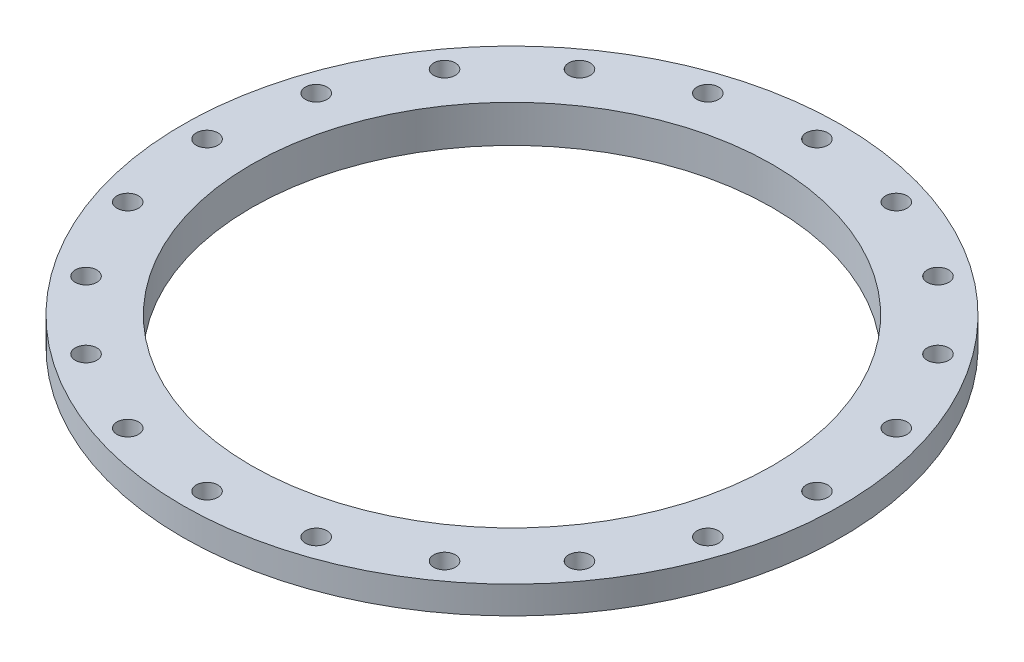
ISO-10303-21;
HEADER;
FILE_DESCRIPTION(('STEP AP214'),'2;1');
FILE_NAME('part.step','',(''),(''),'','','');
FILE_SCHEMA(('AUTOMOTIVE_DESIGN { 1 0 10303 214 1 1 1 1 }'));
ENDSEC;
DATA;
#1=APPLICATION_CONTEXT('core data for automotive mechanical design processes');
#2=APPLICATION_PROTOCOL_DEFINITION('international standard','automotive_design',2000,#1);
#3=PRODUCT_CONTEXT('',#1,'mechanical');
#4=PRODUCT('Part','Part','',(#3));
#5=PRODUCT_RELATED_PRODUCT_CATEGORY('part','',(#4));
#6=PRODUCT_DEFINITION_FORMATION('','',#4);
#7=PRODUCT_DEFINITION_CONTEXT('part definition',#1,'design');
#8=PRODUCT_DEFINITION('design','',#6,#7);
#9=PRODUCT_DEFINITION_SHAPE('','',#8);
#10=(LENGTH_UNIT() NAMED_UNIT(*) SI_UNIT(.MILLI.,.METRE.));
#11=(NAMED_UNIT(*) PLANE_ANGLE_UNIT() SI_UNIT($,.RADIAN.));
#12=(NAMED_UNIT(*) SI_UNIT($,.STERADIAN.) SOLID_ANGLE_UNIT());
#13=UNCERTAINTY_MEASURE_WITH_UNIT(LENGTH_MEASURE(1.E-05),#10,'distance_accuracy_value','');
#14=(GEOMETRIC_REPRESENTATION_CONTEXT(3) GLOBAL_UNCERTAINTY_ASSIGNED_CONTEXT((#13)) GLOBAL_UNIT_ASSIGNED_CONTEXT((#10,
#11,#12)) REPRESENTATION_CONTEXT('',''));
#15=CARTESIAN_POINT('',(0.,0.,0.));
#16=DIRECTION('',(0.,0.,1.));
#17=DIRECTION('',(1.,0.,0.));
#18=AXIS2_PLACEMENT_3D('',#15,#16,#17);
#19=CARTESIAN_POINT('',(0.,19.,265.));
#20=DIRECTION('',(0.,1.,0.));
#21=DIRECTION('',(0.,0.,1.));
#22=AXIS2_PLACEMENT_3D('',#19,#20,#21);
#23=PLANE('',#22);
#24=CARTESIAN_POINT('',(-294.827520051493,18.9999999999999,95.7952682562064));
#25=DIRECTION('',(0.,-1.,0.));
#26=DIRECTION('',(0.,0.,-1.));
#27=AXIS2_PLACEMENT_3D('',#24,#25,#26);
#28=CIRCLE('',#27,11.);
#29=CARTESIAN_POINT('',(-294.827520051493,18.9999999999999,84.7952682562064));
#30=VERTEX_POINT('',#29);
#31=EDGE_CURVE('E151',#30,#30,#28,.T.);
#32=ORIENTED_EDGE('',*,*,#31,.T.);
#33=EDGE_LOOP('',(#32));
#34=FACE_BOUND('',#33,.T.);
#35=CARTESIAN_POINT('',(-309.99999999999,18.9999999999999,-3.16175115773912E-11));
#36=DIRECTION('',(0.,-1.,0.));
#37=DIRECTION('',(0.,0.,-1.));
#38=AXIS2_PLACEMENT_3D('',#35,#36,#37);
#39=CIRCLE('',#38,11.);
#40=CARTESIAN_POINT('',(-309.99999999999,18.9999999999999,-11.0000000000317));
#41=VERTEX_POINT('',#40);
#42=EDGE_CURVE('E155',#41,#41,#39,.T.);
#43=ORIENTED_EDGE('',*,*,#42,.T.);
#44=EDGE_LOOP('',(#43));
#45=FACE_BOUND('',#44,.T.);
#46=CARTESIAN_POINT('',(-294.82752005148,18.9999999999999,-95.7952682562676));
#47=DIRECTION('',(0.,-1.,0.));
#48=DIRECTION('',(0.,0.,-1.));
#49=AXIS2_PLACEMENT_3D('',#46,#47,#48);
#50=CIRCLE('',#49,11.);
#51=CARTESIAN_POINT('',(-294.82752005148,18.9999999999999,-106.795268256268));
#52=VERTEX_POINT('',#51);
#53=EDGE_CURVE('E159',#52,#52,#50,.T.);
#54=ORIENTED_EDGE('',*,*,#53,.T.);
#55=EDGE_LOOP('',(#54));
#56=FACE_BOUND('',#55,.T.);
#57=CARTESIAN_POINT('',(-250.795268256209,18.9999999999999,-182.213428210701));
#58=DIRECTION('',(0.,-1.,0.));
#59=DIRECTION('',(0.,0.,-1.));
#60=AXIS2_PLACEMENT_3D('',#57,#58,#59);
#61=CIRCLE('',#60,11.);
#62=CARTESIAN_POINT('',(-250.795268256209,18.9999999999999,-193.213428210701));
#63=VERTEX_POINT('',#62);
#64=EDGE_CURVE('E163',#63,#63,#61,.T.);
#65=ORIENTED_EDGE('',*,*,#64,.T.);
#66=EDGE_LOOP('',(#65));
#67=FACE_BOUND('',#66,.T.);
#68=CARTESIAN_POINT('',(-182.213428210635,18.9999999999999,-250.795268256265));
#69=DIRECTION('',(0.,-1.,0.));
#70=DIRECTION('',(0.,0.,-1.));
#71=AXIS2_PLACEMENT_3D('',#68,#69,#70);
#72=CIRCLE('',#71,11.);
#73=CARTESIAN_POINT('',(-182.213428210635,18.9999999999999,-261.795268256265));
#74=VERTEX_POINT('',#73);
#75=EDGE_CURVE('E167',#74,#74,#72,.T.);
#76=ORIENTED_EDGE('',*,*,#75,.T.);
#77=EDGE_LOOP('',(#76));
#78=FACE_BOUND('',#77,.T.);
#79=CARTESIAN_POINT('',(-95.7952682561963,18.9999999999999,-294.827520051525));
#80=DIRECTION('',(0.,-1.,0.));
#81=DIRECTION('',(0.,0.,-1.));
#82=AXIS2_PLACEMENT_3D('',#79,#80,#81);
#83=CIRCLE('',#82,11.);
#84=CARTESIAN_POINT('',(-95.7952682561963,18.9999999999999,-305.827520051525));
#85=VERTEX_POINT('',#84);
#86=EDGE_CURVE('E171',#85,#85,#83,.T.);
#87=ORIENTED_EDGE('',*,*,#86,.T.);
#88=EDGE_LOOP('',(#87));
#89=FACE_BOUND('',#88,.T.);
#90=CARTESIAN_POINT('',(4.17618170672537E-11,18.9999999999999,-310.000000000021));
#91=DIRECTION('',(0.,-1.,0.));
#92=DIRECTION('',(0.,0.,-1.));
#93=AXIS2_PLACEMENT_3D('',#90,#91,#92);
#94=CIRCLE('',#93,11.);
#95=CARTESIAN_POINT('',(4.17618170672537E-11,18.9999999999999,-321.000000000021));
#96=VERTEX_POINT('',#95);
#97=EDGE_CURVE('E175',#96,#96,#94,.T.);
#98=ORIENTED_EDGE('',*,*,#97,.T.);
#99=EDGE_LOOP('',(#98));
#100=FACE_BOUND('',#99,.T.);
#101=CARTESIAN_POINT('',(95.7952682562777,18.9999999999999,-294.827520051512));
#102=DIRECTION('',(0.,-1.,0.));
#103=DIRECTION('',(0.,0.,-1.));
#104=AXIS2_PLACEMENT_3D('',#101,#102,#103);
#105=CIRCLE('',#104,11.);
#106=CARTESIAN_POINT('',(95.7952682562777,18.9999999999999,-305.827520051512));
#107=VERTEX_POINT('',#106);
#108=EDGE_CURVE('E179',#107,#107,#105,.T.);
#109=ORIENTED_EDGE('',*,*,#108,.T.);
#110=EDGE_LOOP('',(#109));
#111=FACE_BOUND('',#110,.T.);
#112=CARTESIAN_POINT('',(182.213428210711,18.9999999999999,-250.795268256241));
#113=DIRECTION('',(0.,-1.,0.));
#114=DIRECTION('',(0.,0.,-1.));
#115=AXIS2_PLACEMENT_3D('',#112,#113,#114);
#116=CIRCLE('',#115,11.);
#117=CARTESIAN_POINT('',(182.213428210711,18.9999999999999,-261.795268256241));
#118=VERTEX_POINT('',#117);
#119=EDGE_CURVE('E183',#118,#118,#116,.T.);
#120=ORIENTED_EDGE('',*,*,#119,.T.);
#121=EDGE_LOOP('',(#120));
#122=FACE_BOUND('',#121,.T.);
#123=CARTESIAN_POINT('',(250.795268256276,18.9999999999999,-182.213428210667));
#124=DIRECTION('',(0.,-1.,0.));
#125=DIRECTION('',(0.,0.,-1.));
#126=AXIS2_PLACEMENT_3D('',#123,#124,#125);
#127=CIRCLE('',#126,11.);
#128=CARTESIAN_POINT('',(250.795268256276,18.9999999999999,-193.213428210667));
#129=VERTEX_POINT('',#128);
#130=EDGE_CURVE('E187',#129,#129,#127,.T.);
#131=ORIENTED_EDGE('',*,*,#130,.T.);
#132=EDGE_LOOP('',(#131));
#133=FACE_BOUND('',#132,.T.);
#134=CARTESIAN_POINT('',(294.827520051535,18.9999999999999,-95.7952682562279));
#135=DIRECTION('',(0.,-1.,0.));
#136=DIRECTION('',(0.,0.,-1.));
#137=AXIS2_PLACEMENT_3D('',#134,#135,#136);
#138=CIRCLE('',#137,11.);
#139=CARTESIAN_POINT('',(294.827520051535,18.9999999999999,-106.795268256228));
#140=VERTEX_POINT('',#139);
#141=EDGE_CURVE('E191',#140,#140,#138,.T.);
#142=ORIENTED_EDGE('',*,*,#141,.T.);
#143=EDGE_LOOP('',(#142));
#144=FACE_BOUND('',#143,.T.);
#145=CARTESIAN_POINT('',(310.000000000032,18.9999999999999,1.01740318252108E-11));
#146=DIRECTION('',(0.,-1.,0.));
#147=DIRECTION('',(0.,0.,-1.));
#148=AXIS2_PLACEMENT_3D('',#145,#146,#147);
#149=CIRCLE('',#148,11.);
#150=CARTESIAN_POINT('',(310.000000000032,18.9999999999999,-10.9999999999899));
#151=VERTEX_POINT('',#150);
#152=EDGE_CURVE('E195',#151,#151,#149,.T.);
#153=ORIENTED_EDGE('',*,*,#152,.T.);
#154=EDGE_LOOP('',(#153));
#155=FACE_BOUND('',#154,.T.);
#156=CARTESIAN_POINT('',(294.827520051522,18.9999999999999,95.7952682562462));
#157=DIRECTION('',(0.,-1.,0.));
#158=DIRECTION('',(0.,0.,-1.));
#159=AXIS2_PLACEMENT_3D('',#156,#157,#158);
#160=CIRCLE('',#159,11.);
#161=CARTESIAN_POINT('',(294.827520051522,18.9999999999999,84.7952682562461));
#162=VERTEX_POINT('',#161);
#163=EDGE_CURVE('E199',#162,#162,#160,.T.);
#164=ORIENTED_EDGE('',*,*,#163,.T.);
#165=EDGE_LOOP('',(#164));
#166=FACE_BOUND('',#165,.T.);
#167=CARTESIAN_POINT('',(250.795268256251,18.9999999999999,182.213428210679));
#168=DIRECTION('',(0.,-1.,0.));
#169=DIRECTION('',(0.,0.,-1.));
#170=AXIS2_PLACEMENT_3D('',#167,#168,#169);
#171=CIRCLE('',#170,11.);
#172=CARTESIAN_POINT('',(250.795268256251,18.9999999999999,171.213428210679));
#173=VERTEX_POINT('',#172);
#174=EDGE_CURVE('E203',#173,#173,#171,.T.);
#175=ORIENTED_EDGE('',*,*,#174,.T.);
#176=EDGE_LOOP('',(#175));
#177=FACE_BOUND('',#176,.T.);
#178=CARTESIAN_POINT('',(182.213428210677,18.9999999999999,250.795268256244));
#179=DIRECTION('',(0.,-1.,0.));
#180=DIRECTION('',(0.,0.,-1.));
#181=AXIS2_PLACEMENT_3D('',#178,#179,#180);
#182=CIRCLE('',#181,11.);
#183=CARTESIAN_POINT('',(182.213428210677,18.9999999999999,239.795268256244));
#184=VERTEX_POINT('',#183);
#185=EDGE_CURVE('E207',#184,#184,#182,.T.);
#186=ORIENTED_EDGE('',*,*,#185,.T.);
#187=EDGE_LOOP('',(#186));
#188=FACE_BOUND('',#187,.T.);
#189=CARTESIAN_POINT('',(95.795268256234,18.9999999999999,294.827520051498));
#190=DIRECTION('',(0.,-1.,0.));
#191=DIRECTION('',(0.,0.,-1.));
#192=AXIS2_PLACEMENT_3D('',#189,#190,#191);
#193=CIRCLE('',#192,11.);
#194=CARTESIAN_POINT('',(95.795268256234,18.9999999999999,283.827520051498));
#195=VERTEX_POINT('',#194);
#196=EDGE_CURVE('E211',#195,#195,#193,.T.);
#197=ORIENTED_EDGE('',*,*,#196,.T.);
#198=EDGE_LOOP('',(#197));
#199=FACE_BOUND('',#198,.T.);
#200=CARTESIAN_POINT('',(-250.795268256234,18.9999999999999,182.213428210645));
#201=DIRECTION('',(0.,-1.,0.));
#202=DIRECTION('',(0.,0.,-1.));
#203=AXIS2_PLACEMENT_3D('',#200,#201,#202);
#204=CIRCLE('',#203,11.);
#205=CARTESIAN_POINT('',(-250.795268256234,18.9999999999999,171.213428210645));
#206=VERTEX_POINT('',#205);
#207=EDGE_CURVE('E215',#206,#206,#204,.T.);
#208=ORIENTED_EDGE('',*,*,#207,.T.);
#209=EDGE_LOOP('',(#208));
#210=FACE_BOUND('',#209,.T.);
#211=CARTESIAN_POINT('',(-182.213428210669,18.9999999999999,250.795268256219));
#212=DIRECTION('',(0.,-1.,0.));
#213=DIRECTION('',(0.,0.,-1.));
#214=AXIS2_PLACEMENT_3D('',#211,#212,#213);
#215=CIRCLE('',#214,11.);
#216=CARTESIAN_POINT('',(-182.213428210669,18.9999999999999,239.795268256219));
#217=VERTEX_POINT('',#216);
#218=EDGE_CURVE('E219',#217,#217,#215,.T.);
#219=ORIENTED_EDGE('',*,*,#218,.T.);
#220=EDGE_LOOP('',(#219));
#221=FACE_BOUND('',#220,.T.);
#222=CARTESIAN_POINT('',(-95.795268256236,18.9999999999999,294.827520051491));
#223=DIRECTION('',(0.,-1.,0.));
#224=DIRECTION('',(0.,0.,-1.));
#225=AXIS2_PLACEMENT_3D('',#222,#223,#224);
#226=CIRCLE('',#225,11.);
#227=CARTESIAN_POINT('',(-95.795268256236,18.9999999999999,283.827520051491));
#228=VERTEX_POINT('',#227);
#229=EDGE_CURVE('E223',#228,#228,#226,.T.);
#230=ORIENTED_EDGE('',*,*,#229,.T.);
#231=EDGE_LOOP('',(#230));
#232=FACE_BOUND('',#231,.T.);
#233=CARTESIAN_POINT('',(0.,18.9999999999999,310.));
#234=DIRECTION('',(0.,-1.,0.));
#235=DIRECTION('',(0.,0.,-1.));
#236=AXIS2_PLACEMENT_3D('',#233,#234,#235);
#237=CIRCLE('',#236,11.);
#238=CARTESIAN_POINT('',(0.,18.9999999999999,299.));
#239=VERTEX_POINT('',#238);
#240=EDGE_CURVE('E51',#239,#239,#237,.T.);
#241=ORIENTED_EDGE('',*,*,#240,.T.);
#242=EDGE_LOOP('',(#241));
#243=FACE_BOUND('',#242,.T.);
#244=CARTESIAN_POINT('',(0.,18.9999999999999,0.));
#245=DIRECTION('',(0.,1.,0.));
#246=DIRECTION('',(0.,0.,1.));
#247=AXIS2_PLACEMENT_3D('',#244,#245,#246);
#248=CIRCLE('',#247,335.);
#249=CARTESIAN_POINT('',(0.,18.9999999999999,335.));
#250=VERTEX_POINT('',#249);
#251=EDGE_CURVE('E10',#250,#250,#248,.T.);
#252=ORIENTED_EDGE('',*,*,#251,.T.);
#253=EDGE_LOOP('',(#252));
#254=FACE_BOUND('',#253,.T.);
#255=CARTESIAN_POINT('',(0.,18.9999999999999,0.));
#256=DIRECTION('',(0.,1.,0.));
#257=DIRECTION('',(0.,0.,1.));
#258=AXIS2_PLACEMENT_3D('',#255,#256,#257);
#259=CIRCLE('',#258,265.);
#260=CARTESIAN_POINT('',(0.,18.9999999999999,265.));
#261=VERTEX_POINT('',#260);
#262=EDGE_CURVE('E106',#261,#261,#259,.T.);
#263=ORIENTED_EDGE('',*,*,#262,.F.);
#264=EDGE_LOOP('',(#263));
#265=FACE_BOUND('',#264,.T.);
#266=ADVANCED_FACE('F31',(#34,#45,#56,#67,#78,#89,#100,#111,#122,#133,#144,#155,#166,#177,#188,
#199,#210,#221,#232,#243,#254,#265),#23,.T.);
#267=CARTESIAN_POINT('',(0.,1813.31659334197,0.));
#268=DIRECTION('',(0.,1.,0.));
#269=DIRECTION('',(0.,0.,1.));
#270=AXIS2_PLACEMENT_3D('',#267,#268,#269);
#271=CYLINDRICAL_SURFACE('',#270,335.);
#272=CARTESIAN_POINT('',(0.,-8.9999999999999,0.));
#273=DIRECTION('',(0.,1.,0.));
#274=DIRECTION('',(0.,0.,1.));
#275=AXIS2_PLACEMENT_3D('',#272,#273,#274);
#276=CIRCLE('',#275,335.);
#277=CARTESIAN_POINT('',(0.,-8.9999999999999,335.));
#278=VERTEX_POINT('',#277);
#279=EDGE_CURVE('E38',#278,#278,#276,.T.);
#280=ORIENTED_EDGE('',*,*,#279,.T.);
#281=EDGE_LOOP('',(#280));
#282=FACE_BOUND('',#281,.T.);
#283=ORIENTED_EDGE('',*,*,#251,.F.);
#284=EDGE_LOOP('',(#283));
#285=FACE_BOUND('',#284,.T.);
#286=ADVANCED_FACE('F139',(#282,#285),#271,.T.);
#287=CARTESIAN_POINT('',(0.,-9.,335.));
#288=DIRECTION('',(0.,-1.,0.));
#289=DIRECTION('',(0.,0.,-1.));
#290=AXIS2_PLACEMENT_3D('',#287,#288,#289);
#291=PLANE('',#290);
#292=CARTESIAN_POINT('',(-294.827520051493,-9.,95.7952682562064));
#293=DIRECTION('',(0.,-1.,0.));
#294=DIRECTION('',(0.,0.,-1.));
#295=AXIS2_PLACEMENT_3D('',#292,#293,#294);
#296=CIRCLE('',#295,11.);
#297=CARTESIAN_POINT('',(-294.827520051493,-9.,84.7952682562064));
#298=VERTEX_POINT('',#297);
#299=EDGE_CURVE('E34',#298,#298,#296,.T.);
#300=ORIENTED_EDGE('',*,*,#299,.F.);
#301=EDGE_LOOP('',(#300));
#302=FACE_BOUND('',#301,.T.);
#303=CARTESIAN_POINT('',(-309.99999999999,-9.,-3.16175115773912E-11));
#304=DIRECTION('',(0.,-1.,0.));
#305=DIRECTION('',(0.,0.,-1.));
#306=AXIS2_PLACEMENT_3D('',#303,#304,#305);
#307=CIRCLE('',#306,11.);
#308=CARTESIAN_POINT('',(-309.99999999999,-9.,-11.0000000000317));
#309=VERTEX_POINT('',#308);
#310=EDGE_CURVE('E101',#309,#309,#307,.T.);
#311=ORIENTED_EDGE('',*,*,#310,.F.);
#312=EDGE_LOOP('',(#311));
#313=FACE_BOUND('',#312,.T.);
#314=CARTESIAN_POINT('',(-294.82752005148,-9.,-95.7952682562676));
#315=DIRECTION('',(0.,-1.,0.));
#316=DIRECTION('',(0.,0.,-1.));
#317=AXIS2_PLACEMENT_3D('',#314,#315,#316);
#318=CIRCLE('',#317,11.);
#319=CARTESIAN_POINT('',(-294.82752005148,-9.,-106.795268256268));
#320=VERTEX_POINT('',#319);
#321=EDGE_CURVE('E99',#320,#320,#318,.T.);
#322=ORIENTED_EDGE('',*,*,#321,.F.);
#323=EDGE_LOOP('',(#322));
#324=FACE_BOUND('',#323,.T.);
#325=CARTESIAN_POINT('',(-250.795268256209,-9.,-182.213428210701));
#326=DIRECTION('',(0.,-1.,0.));
#327=DIRECTION('',(0.,0.,-1.));
#328=AXIS2_PLACEMENT_3D('',#325,#326,#327);
#329=CIRCLE('',#328,11.);
#330=CARTESIAN_POINT('',(-250.795268256209,-9.,-193.213428210701));
#331=VERTEX_POINT('',#330);
#332=EDGE_CURVE('E96',#331,#331,#329,.T.);
#333=ORIENTED_EDGE('',*,*,#332,.F.);
#334=EDGE_LOOP('',(#333));
#335=FACE_BOUND('',#334,.T.);
#336=CARTESIAN_POINT('',(-182.213428210635,-9.,-250.795268256265));
#337=DIRECTION('',(0.,-1.,0.));
#338=DIRECTION('',(0.,0.,-1.));
#339=AXIS2_PLACEMENT_3D('',#336,#337,#338);
#340=CIRCLE('',#339,11.);
#341=CARTESIAN_POINT('',(-182.213428210635,-9.,-261.795268256265));
#342=VERTEX_POINT('',#341);
#343=EDGE_CURVE('E93',#342,#342,#340,.T.);
#344=ORIENTED_EDGE('',*,*,#343,.F.);
#345=EDGE_LOOP('',(#344));
#346=FACE_BOUND('',#345,.T.);
#347=CARTESIAN_POINT('',(-95.7952682561963,-9.,-294.827520051525));
#348=DIRECTION('',(0.,-1.,0.));
#349=DIRECTION('',(0.,0.,-1.));
#350=AXIS2_PLACEMENT_3D('',#347,#348,#349);
#351=CIRCLE('',#350,11.);
#352=CARTESIAN_POINT('',(-95.7952682561963,-9.,-305.827520051525));
#353=VERTEX_POINT('',#352);
#354=EDGE_CURVE('E90',#353,#353,#351,.T.);
#355=ORIENTED_EDGE('',*,*,#354,.F.);
#356=EDGE_LOOP('',(#355));
#357=FACE_BOUND('',#356,.T.);
#358=CARTESIAN_POINT('',(4.17618170672537E-11,-9.,-310.000000000021));
#359=DIRECTION('',(0.,-1.,0.));
#360=DIRECTION('',(0.,0.,-1.));
#361=AXIS2_PLACEMENT_3D('',#358,#359,#360);
#362=CIRCLE('',#361,11.);
#363=CARTESIAN_POINT('',(4.17618170672537E-11,-9.,-321.000000000021));
#364=VERTEX_POINT('',#363);
#365=EDGE_CURVE('E87',#364,#364,#362,.T.);
#366=ORIENTED_EDGE('',*,*,#365,.F.);
#367=EDGE_LOOP('',(#366));
#368=FACE_BOUND('',#367,.T.);
#369=CARTESIAN_POINT('',(95.7952682562777,-9.,-294.827520051512));
#370=DIRECTION('',(0.,-1.,0.));
#371=DIRECTION('',(0.,0.,-1.));
#372=AXIS2_PLACEMENT_3D('',#369,#370,#371);
#373=CIRCLE('',#372,11.);
#374=CARTESIAN_POINT('',(95.7952682562777,-9.,-305.827520051512));
#375=VERTEX_POINT('',#374);
#376=EDGE_CURVE('E84',#375,#375,#373,.T.);
#377=ORIENTED_EDGE('',*,*,#376,.F.);
#378=EDGE_LOOP('',(#377));
#379=FACE_BOUND('',#378,.T.);
#380=CARTESIAN_POINT('',(182.213428210711,-9.,-250.795268256241));
#381=DIRECTION('',(0.,-1.,0.));
#382=DIRECTION('',(0.,0.,-1.));
#383=AXIS2_PLACEMENT_3D('',#380,#381,#382);
#384=CIRCLE('',#383,11.);
#385=CARTESIAN_POINT('',(182.213428210711,-9.,-261.795268256241));
#386=VERTEX_POINT('',#385);
#387=EDGE_CURVE('E81',#386,#386,#384,.T.);
#388=ORIENTED_EDGE('',*,*,#387,.F.);
#389=EDGE_LOOP('',(#388));
#390=FACE_BOUND('',#389,.T.);
#391=CARTESIAN_POINT('',(250.795268256276,-9.,-182.213428210667));
#392=DIRECTION('',(0.,-1.,0.));
#393=DIRECTION('',(0.,0.,-1.));
#394=AXIS2_PLACEMENT_3D('',#391,#392,#393);
#395=CIRCLE('',#394,11.);
#396=CARTESIAN_POINT('',(250.795268256276,-9.,-193.213428210667));
#397=VERTEX_POINT('',#396);
#398=EDGE_CURVE('E78',#397,#397,#395,.T.);
#399=ORIENTED_EDGE('',*,*,#398,.F.);
#400=EDGE_LOOP('',(#399));
#401=FACE_BOUND('',#400,.T.);
#402=CARTESIAN_POINT('',(294.827520051535,-9.,-95.7952682562279));
#403=DIRECTION('',(0.,-1.,0.));
#404=DIRECTION('',(0.,0.,-1.));
#405=AXIS2_PLACEMENT_3D('',#402,#403,#404);
#406=CIRCLE('',#405,11.);
#407=CARTESIAN_POINT('',(294.827520051535,-9.,-106.795268256228));
#408=VERTEX_POINT('',#407);
#409=EDGE_CURVE('E75',#408,#408,#406,.T.);
#410=ORIENTED_EDGE('',*,*,#409,.F.);
#411=EDGE_LOOP('',(#410));
#412=FACE_BOUND('',#411,.T.);
#413=CARTESIAN_POINT('',(310.000000000032,-9.,1.01740318252108E-11));
#414=DIRECTION('',(0.,-1.,0.));
#415=DIRECTION('',(0.,0.,-1.));
#416=AXIS2_PLACEMENT_3D('',#413,#414,#415);
#417=CIRCLE('',#416,11.);
#418=CARTESIAN_POINT('',(310.000000000032,-9.,-10.9999999999899));
#419=VERTEX_POINT('',#418);
#420=EDGE_CURVE('E72',#419,#419,#417,.T.);
#421=ORIENTED_EDGE('',*,*,#420,.F.);
#422=EDGE_LOOP('',(#421));
#423=FACE_BOUND('',#422,.T.);
#424=CARTESIAN_POINT('',(294.827520051522,-9.,95.7952682562462));
#425=DIRECTION('',(0.,-1.,0.));
#426=DIRECTION('',(0.,0.,-1.));
#427=AXIS2_PLACEMENT_3D('',#424,#425,#426);
#428=CIRCLE('',#427,11.);
#429=CARTESIAN_POINT('',(294.827520051522,-9.,84.7952682562461));
#430=VERTEX_POINT('',#429);
#431=EDGE_CURVE('E69',#430,#430,#428,.T.);
#432=ORIENTED_EDGE('',*,*,#431,.F.);
#433=EDGE_LOOP('',(#432));
#434=FACE_BOUND('',#433,.T.);
#435=CARTESIAN_POINT('',(250.795268256251,-9.,182.213428210679));
#436=DIRECTION('',(0.,-1.,0.));
#437=DIRECTION('',(0.,0.,-1.));
#438=AXIS2_PLACEMENT_3D('',#435,#436,#437);
#439=CIRCLE('',#438,11.);
#440=CARTESIAN_POINT('',(250.795268256251,-9.,171.213428210679));
#441=VERTEX_POINT('',#440);
#442=EDGE_CURVE('E66',#441,#441,#439,.T.);
#443=ORIENTED_EDGE('',*,*,#442,.F.);
#444=EDGE_LOOP('',(#443));
#445=FACE_BOUND('',#444,.T.);
#446=CARTESIAN_POINT('',(182.213428210677,-9.,250.795268256244));
#447=DIRECTION('',(0.,-1.,0.));
#448=DIRECTION('',(0.,0.,-1.));
#449=AXIS2_PLACEMENT_3D('',#446,#447,#448);
#450=CIRCLE('',#449,11.);
#451=CARTESIAN_POINT('',(182.213428210677,-9.,239.795268256244));
#452=VERTEX_POINT('',#451);
#453=EDGE_CURVE('E63',#452,#452,#450,.T.);
#454=ORIENTED_EDGE('',*,*,#453,.F.);
#455=EDGE_LOOP('',(#454));
#456=FACE_BOUND('',#455,.T.);
#457=CARTESIAN_POINT('',(95.795268256234,-9.,294.827520051498));
#458=DIRECTION('',(0.,-1.,0.));
#459=DIRECTION('',(0.,0.,-1.));
#460=AXIS2_PLACEMENT_3D('',#457,#458,#459);
#461=CIRCLE('',#460,11.);
#462=CARTESIAN_POINT('',(95.795268256234,-9.,283.827520051498));
#463=VERTEX_POINT('',#462);
#464=EDGE_CURVE('E60',#463,#463,#461,.T.);
#465=ORIENTED_EDGE('',*,*,#464,.F.);
#466=EDGE_LOOP('',(#465));
#467=FACE_BOUND('',#466,.T.);
#468=CARTESIAN_POINT('',(-250.795268256234,-9.,182.213428210645));
#469=DIRECTION('',(0.,-1.,0.));
#470=DIRECTION('',(0.,0.,-1.));
#471=AXIS2_PLACEMENT_3D('',#468,#469,#470);
#472=CIRCLE('',#471,11.);
#473=CARTESIAN_POINT('',(-250.795268256234,-9.,171.213428210645));
#474=VERTEX_POINT('',#473);
#475=EDGE_CURVE('E57',#474,#474,#472,.T.);
#476=ORIENTED_EDGE('',*,*,#475,.F.);
#477=EDGE_LOOP('',(#476));
#478=FACE_BOUND('',#477,.T.);
#479=CARTESIAN_POINT('',(-182.213428210669,-9.,250.795268256219));
#480=DIRECTION('',(0.,-1.,0.));
#481=DIRECTION('',(0.,0.,-1.));
#482=AXIS2_PLACEMENT_3D('',#479,#480,#481);
#483=CIRCLE('',#482,11.);
#484=CARTESIAN_POINT('',(-182.213428210669,-9.,239.795268256219));
#485=VERTEX_POINT('',#484);
#486=EDGE_CURVE('E54',#485,#485,#483,.T.);
#487=ORIENTED_EDGE('',*,*,#486,.F.);
#488=EDGE_LOOP('',(#487));
#489=FACE_BOUND('',#488,.T.);
#490=CARTESIAN_POINT('',(-95.795268256236,-9.,294.827520051491));
#491=DIRECTION('',(0.,-1.,0.));
#492=DIRECTION('',(0.,0.,-1.));
#493=AXIS2_PLACEMENT_3D('',#490,#491,#492);
#494=CIRCLE('',#493,11.);
#495=CARTESIAN_POINT('',(-95.795268256236,-9.,283.827520051491));
#496=VERTEX_POINT('',#495);
#497=EDGE_CURVE('E50',#496,#496,#494,.T.);
#498=ORIENTED_EDGE('',*,*,#497,.F.);
#499=EDGE_LOOP('',(#498));
#500=FACE_BOUND('',#499,.T.);
#501=CARTESIAN_POINT('',(0.,-9.,310.));
#502=DIRECTION('',(0.,-1.,0.));
#503=DIRECTION('',(0.,0.,-1.));
#504=AXIS2_PLACEMENT_3D('',#501,#502,#503);
#505=CIRCLE('',#504,11.);
#506=CARTESIAN_POINT('',(0.,-9.,299.));
#507=VERTEX_POINT('',#506);
#508=EDGE_CURVE('E47',#507,#507,#505,.T.);
#509=ORIENTED_EDGE('',*,*,#508,.F.);
#510=EDGE_LOOP('',(#509));
#511=FACE_BOUND('',#510,.T.);
#512=CARTESIAN_POINT('',(0.,-8.9999999999999,0.));
#513=DIRECTION('',(0.,1.,0.));
#514=DIRECTION('',(0.,0.,1.));
#515=AXIS2_PLACEMENT_3D('',#512,#513,#514);
#516=CIRCLE('',#515,296.139702342662);
#517=CARTESIAN_POINT('',(0.,-8.9999999999999,296.139702342662));
#518=VERTEX_POINT('',#517);
#519=EDGE_CURVE('E43',#518,#518,#516,.T.);
#520=ORIENTED_EDGE('',*,*,#519,.T.);
#521=EDGE_LOOP('',(#520));
#522=FACE_BOUND('',#521,.T.);
#523=ORIENTED_EDGE('',*,*,#279,.F.);
#524=EDGE_LOOP('',(#523));
#525=FACE_BOUND('',#524,.T.);
#526=ADVANCED_FACE('F124',(#302,#313,#324,#335,#346,#357,#368,#379,#390,#401,#412,#423,#434,
#445,#456,#467,#478,#489,#500,#511,#522,#525),#291,.T.);
#527=CARTESIAN_POINT('',(0.,-8.9999999999999,0.));
#528=DIRECTION('',(0.,1.,0.));
#529=DIRECTION('',(0.,0.,1.));
#530=AXIS2_PLACEMENT_3D('',#527,#528,#529);
#531=CONICAL_SURFACE('',#530,296.139702342662,0.349065850398862);
#532=CARTESIAN_POINT('',(0.,-18.9999999999999,0.));
#533=DIRECTION('',(0.,1.,0.));
#534=DIRECTION('',(0.,0.,1.));
#535=AXIS2_PLACEMENT_3D('',#532,#533,#534);
#536=CIRCLE('',#535,292.5);
#537=CARTESIAN_POINT('',(0.,-18.9999999999999,292.5));
#538=VERTEX_POINT('',#537);
#539=EDGE_CURVE('E115',#538,#538,#536,.T.);
#540=ORIENTED_EDGE('',*,*,#539,.T.);
#541=EDGE_LOOP('',(#540));
#542=FACE_BOUND('',#541,.T.);
#543=ORIENTED_EDGE('',*,*,#519,.F.);
#544=EDGE_LOOP('',(#543));
#545=FACE_BOUND('',#544,.T.);
#546=ADVANCED_FACE('F127',(#542,#545),#531,.T.);
#547=CARTESIAN_POINT('',(0.,-19.,292.5));
#548=DIRECTION('',(0.,-1.,0.));
#549=DIRECTION('',(0.,0.,-1.));
#550=AXIS2_PLACEMENT_3D('',#547,#548,#549);
#551=PLANE('',#550);
#552=CARTESIAN_POINT('',(0.,-18.9999999999999,0.));
#553=DIRECTION('',(0.,1.,0.));
#554=DIRECTION('',(0.,0.,1.));
#555=AXIS2_PLACEMENT_3D('',#552,#553,#554);
#556=CIRCLE('',#555,265.);
#557=CARTESIAN_POINT('',(0.,-18.9999999999999,265.));
#558=VERTEX_POINT('',#557);
#559=EDGE_CURVE('E110',#558,#558,#556,.T.);
#560=ORIENTED_EDGE('',*,*,#559,.T.);
#561=EDGE_LOOP('',(#560));
#562=FACE_BOUND('',#561,.T.);
#563=ORIENTED_EDGE('',*,*,#539,.F.);
#564=EDGE_LOOP('',(#563));
#565=FACE_BOUND('',#564,.T.);
#566=ADVANCED_FACE('F129',(#562,#565),#551,.T.);
#567=CARTESIAN_POINT('',(0.,1813.31659334197,0.));
#568=DIRECTION('',(0.,1.,0.));
#569=DIRECTION('',(0.,0.,1.));
#570=AXIS2_PLACEMENT_3D('',#567,#568,#569);
#571=CYLINDRICAL_SURFACE('',#570,265.);
#572=ORIENTED_EDGE('',*,*,#262,.T.);
#573=EDGE_LOOP('',(#572));
#574=FACE_BOUND('',#573,.T.);
#575=ORIENTED_EDGE('',*,*,#559,.F.);
#576=EDGE_LOOP('',(#575));
#577=FACE_BOUND('',#576,.T.);
#578=ADVANCED_FACE('F136',(#574,#577),#571,.F.);
#579=CARTESIAN_POINT('',(0.,18.9999999999999,310.));
#580=DIRECTION('',(0.,-1.,0.));
#581=DIRECTION('',(0.,0.,-1.));
#582=AXIS2_PLACEMENT_3D('',#579,#580,#581);
#583=CYLINDRICAL_SURFACE('',#582,11.);
#584=ORIENTED_EDGE('',*,*,#508,.T.);
#585=EDGE_LOOP('',(#584));
#586=FACE_BOUND('',#585,.T.);
#587=ORIENTED_EDGE('',*,*,#240,.F.);
#588=EDGE_LOOP('',(#587));
#589=FACE_BOUND('',#588,.T.);
#590=ADVANCED_FACE('F246',(#586,#589),#583,.F.);
#591=CARTESIAN_POINT('',(-95.795268256236,18.9999999999999,294.827520051491));
#592=DIRECTION('',(0.,-1.,0.));
#593=DIRECTION('',(0.,0.,-1.));
#594=AXIS2_PLACEMENT_3D('',#591,#592,#593);
#595=CYLINDRICAL_SURFACE('',#594,11.);
#596=ORIENTED_EDGE('',*,*,#497,.T.);
#597=EDGE_LOOP('',(#596));
#598=FACE_BOUND('',#597,.T.);
#599=ORIENTED_EDGE('',*,*,#229,.F.);
#600=EDGE_LOOP('',(#599));
#601=FACE_BOUND('',#600,.T.);
#602=ADVANCED_FACE('F248',(#598,#601),#595,.F.);
#603=CARTESIAN_POINT('',(-182.213428210669,18.9999999999999,250.795268256219));
#604=DIRECTION('',(0.,-1.,0.));
#605=DIRECTION('',(0.,0.,-1.));
#606=AXIS2_PLACEMENT_3D('',#603,#604,#605);
#607=CYLINDRICAL_SURFACE('',#606,11.);
#608=ORIENTED_EDGE('',*,*,#486,.T.);
#609=EDGE_LOOP('',(#608));
#610=FACE_BOUND('',#609,.T.);
#611=ORIENTED_EDGE('',*,*,#218,.F.);
#612=EDGE_LOOP('',(#611));
#613=FACE_BOUND('',#612,.T.);
#614=ADVANCED_FACE('F255',(#610,#613),#607,.F.);
#615=CARTESIAN_POINT('',(-250.795268256234,18.9999999999999,182.213428210645));
#616=DIRECTION('',(0.,-1.,0.));
#617=DIRECTION('',(0.,0.,-1.));
#618=AXIS2_PLACEMENT_3D('',#615,#616,#617);
#619=CYLINDRICAL_SURFACE('',#618,11.);
#620=ORIENTED_EDGE('',*,*,#475,.T.);
#621=EDGE_LOOP('',(#620));
#622=FACE_BOUND('',#621,.T.);
#623=ORIENTED_EDGE('',*,*,#207,.F.);
#624=EDGE_LOOP('',(#623));
#625=FACE_BOUND('',#624,.T.);
#626=ADVANCED_FACE('F292',(#622,#625),#619,.F.);
#627=CARTESIAN_POINT('',(95.795268256234,18.9999999999999,294.827520051498));
#628=DIRECTION('',(0.,-1.,0.));
#629=DIRECTION('',(0.,0.,-1.));
#630=AXIS2_PLACEMENT_3D('',#627,#628,#629);
#631=CYLINDRICAL_SURFACE('',#630,11.);
#632=ORIENTED_EDGE('',*,*,#464,.T.);
#633=EDGE_LOOP('',(#632));
#634=FACE_BOUND('',#633,.T.);
#635=ORIENTED_EDGE('',*,*,#196,.F.);
#636=EDGE_LOOP('',(#635));
#637=FACE_BOUND('',#636,.T.);
#638=ADVANCED_FACE('F288',(#634,#637),#631,.F.);
#639=CARTESIAN_POINT('',(182.213428210677,18.9999999999999,250.795268256244));
#640=DIRECTION('',(0.,-1.,0.));
#641=DIRECTION('',(0.,0.,-1.));
#642=AXIS2_PLACEMENT_3D('',#639,#640,#641);
#643=CYLINDRICAL_SURFACE('',#642,11.);
#644=ORIENTED_EDGE('',*,*,#453,.T.);
#645=EDGE_LOOP('',(#644));
#646=FACE_BOUND('',#645,.T.);
#647=ORIENTED_EDGE('',*,*,#185,.F.);
#648=EDGE_LOOP('',(#647));
#649=FACE_BOUND('',#648,.T.);
#650=ADVANCED_FACE('F284',(#646,#649),#643,.F.);
#651=CARTESIAN_POINT('',(250.795268256251,18.9999999999999,182.213428210679));
#652=DIRECTION('',(0.,-1.,0.));
#653=DIRECTION('',(0.,0.,-1.));
#654=AXIS2_PLACEMENT_3D('',#651,#652,#653);
#655=CYLINDRICAL_SURFACE('',#654,11.);
#656=ORIENTED_EDGE('',*,*,#442,.T.);
#657=EDGE_LOOP('',(#656));
#658=FACE_BOUND('',#657,.T.);
#659=ORIENTED_EDGE('',*,*,#174,.F.);
#660=EDGE_LOOP('',(#659));
#661=FACE_BOUND('',#660,.T.);
#662=ADVANCED_FACE('F280',(#658,#661),#655,.F.);
#663=CARTESIAN_POINT('',(294.827520051522,18.9999999999999,95.7952682562462));
#664=DIRECTION('',(0.,-1.,0.));
#665=DIRECTION('',(0.,0.,-1.));
#666=AXIS2_PLACEMENT_3D('',#663,#664,#665);
#667=CYLINDRICAL_SURFACE('',#666,11.);
#668=ORIENTED_EDGE('',*,*,#431,.T.);
#669=EDGE_LOOP('',(#668));
#670=FACE_BOUND('',#669,.T.);
#671=ORIENTED_EDGE('',*,*,#163,.F.);
#672=EDGE_LOOP('',(#671));
#673=FACE_BOUND('',#672,.T.);
#674=ADVANCED_FACE('F276',(#670,#673),#667,.F.);
#675=CARTESIAN_POINT('',(310.000000000032,18.9999999999999,1.01740318252108E-11));
#676=DIRECTION('',(0.,-1.,0.));
#677=DIRECTION('',(0.,0.,-1.));
#678=AXIS2_PLACEMENT_3D('',#675,#676,#677);
#679=CYLINDRICAL_SURFACE('',#678,11.);
#680=ORIENTED_EDGE('',*,*,#420,.T.);
#681=EDGE_LOOP('',(#680));
#682=FACE_BOUND('',#681,.T.);
#683=ORIENTED_EDGE('',*,*,#152,.F.);
#684=EDGE_LOOP('',(#683));
#685=FACE_BOUND('',#684,.T.);
#686=ADVANCED_FACE('F272',(#682,#685),#679,.F.);
#687=CARTESIAN_POINT('',(294.827520051535,18.9999999999999,-95.7952682562279));
#688=DIRECTION('',(0.,-1.,0.));
#689=DIRECTION('',(0.,0.,-1.));
#690=AXIS2_PLACEMENT_3D('',#687,#688,#689);
#691=CYLINDRICAL_SURFACE('',#690,11.);
#692=ORIENTED_EDGE('',*,*,#409,.T.);
#693=EDGE_LOOP('',(#692));
#694=FACE_BOUND('',#693,.T.);
#695=ORIENTED_EDGE('',*,*,#141,.F.);
#696=EDGE_LOOP('',(#695));
#697=FACE_BOUND('',#696,.T.);
#698=ADVANCED_FACE('F268',(#694,#697),#691,.F.);
#699=CARTESIAN_POINT('',(250.795268256276,18.9999999999999,-182.213428210667));
#700=DIRECTION('',(0.,-1.,0.));
#701=DIRECTION('',(0.,0.,-1.));
#702=AXIS2_PLACEMENT_3D('',#699,#700,#701);
#703=CYLINDRICAL_SURFACE('',#702,11.);
#704=ORIENTED_EDGE('',*,*,#398,.T.);
#705=EDGE_LOOP('',(#704));
#706=FACE_BOUND('',#705,.T.);
#707=ORIENTED_EDGE('',*,*,#130,.F.);
#708=EDGE_LOOP('',(#707));
#709=FACE_BOUND('',#708,.T.);
#710=ADVANCED_FACE('F264',(#706,#709),#703,.F.);
#711=CARTESIAN_POINT('',(182.213428210711,18.9999999999999,-250.795268256241));
#712=DIRECTION('',(0.,-1.,0.));
#713=DIRECTION('',(0.,0.,-1.));
#714=AXIS2_PLACEMENT_3D('',#711,#712,#713);
#715=CYLINDRICAL_SURFACE('',#714,11.);
#716=ORIENTED_EDGE('',*,*,#387,.T.);
#717=EDGE_LOOP('',(#716));
#718=FACE_BOUND('',#717,.T.);
#719=ORIENTED_EDGE('',*,*,#119,.F.);
#720=EDGE_LOOP('',(#719));
#721=FACE_BOUND('',#720,.T.);
#722=ADVANCED_FACE('F260',(#718,#721),#715,.F.);
#723=CARTESIAN_POINT('',(95.7952682562777,18.9999999999999,-294.827520051512));
#724=DIRECTION('',(0.,-1.,0.));
#725=DIRECTION('',(0.,0.,-1.));
#726=AXIS2_PLACEMENT_3D('',#723,#724,#725);
#727=CYLINDRICAL_SURFACE('',#726,11.);
#728=ORIENTED_EDGE('',*,*,#376,.T.);
#729=EDGE_LOOP('',(#728));
#730=FACE_BOUND('',#729,.T.);
#731=ORIENTED_EDGE('',*,*,#108,.F.);
#732=EDGE_LOOP('',(#731));
#733=FACE_BOUND('',#732,.T.);
#734=ADVANCED_FACE('F263',(#730,#733),#727,.F.);
#735=CARTESIAN_POINT('',(4.17618170672537E-11,18.9999999999999,-310.000000000021));
#736=DIRECTION('',(0.,-1.,0.));
#737=DIRECTION('',(0.,0.,-1.));
#738=AXIS2_PLACEMENT_3D('',#735,#736,#737);
#739=CYLINDRICAL_SURFACE('',#738,11.);
#740=ORIENTED_EDGE('',*,*,#365,.T.);
#741=EDGE_LOOP('',(#740));
#742=FACE_BOUND('',#741,.T.);
#743=ORIENTED_EDGE('',*,*,#97,.F.);
#744=EDGE_LOOP('',(#743));
#745=FACE_BOUND('',#744,.T.);
#746=ADVANCED_FACE('F315',(#742,#745),#739,.F.);
#747=CARTESIAN_POINT('',(-95.7952682561963,18.9999999999999,-294.827520051525));
#748=DIRECTION('',(0.,-1.,0.));
#749=DIRECTION('',(0.,0.,-1.));
#750=AXIS2_PLACEMENT_3D('',#747,#748,#749);
#751=CYLINDRICAL_SURFACE('',#750,11.);
#752=ORIENTED_EDGE('',*,*,#354,.T.);
#753=EDGE_LOOP('',(#752));
#754=FACE_BOUND('',#753,.T.);
#755=ORIENTED_EDGE('',*,*,#86,.F.);
#756=EDGE_LOOP('',(#755));
#757=FACE_BOUND('',#756,.T.);
#758=ADVANCED_FACE('F311',(#754,#757),#751,.F.);
#759=CARTESIAN_POINT('',(-182.213428210635,18.9999999999999,-250.795268256265));
#760=DIRECTION('',(0.,-1.,0.));
#761=DIRECTION('',(0.,0.,-1.));
#762=AXIS2_PLACEMENT_3D('',#759,#760,#761);
#763=CYLINDRICAL_SURFACE('',#762,11.);
#764=ORIENTED_EDGE('',*,*,#343,.T.);
#765=EDGE_LOOP('',(#764));
#766=FACE_BOUND('',#765,.T.);
#767=ORIENTED_EDGE('',*,*,#75,.F.);
#768=EDGE_LOOP('',(#767));
#769=FACE_BOUND('',#768,.T.);
#770=ADVANCED_FACE('F307',(#766,#769),#763,.F.);
#771=CARTESIAN_POINT('',(-250.795268256209,18.9999999999999,-182.213428210701));
#772=DIRECTION('',(0.,-1.,0.));
#773=DIRECTION('',(0.,0.,-1.));
#774=AXIS2_PLACEMENT_3D('',#771,#772,#773);
#775=CYLINDRICAL_SURFACE('',#774,11.);
#776=ORIENTED_EDGE('',*,*,#332,.T.);
#777=EDGE_LOOP('',(#776));
#778=FACE_BOUND('',#777,.T.);
#779=ORIENTED_EDGE('',*,*,#64,.F.);
#780=EDGE_LOOP('',(#779));
#781=FACE_BOUND('',#780,.T.);
#782=ADVANCED_FACE('F303',(#778,#781),#775,.F.);
#783=CARTESIAN_POINT('',(-294.82752005148,18.9999999999999,-95.7952682562676));
#784=DIRECTION('',(0.,-1.,0.));
#785=DIRECTION('',(0.,0.,-1.));
#786=AXIS2_PLACEMENT_3D('',#783,#784,#785);
#787=CYLINDRICAL_SURFACE('',#786,11.);
#788=ORIENTED_EDGE('',*,*,#321,.T.);
#789=EDGE_LOOP('',(#788));
#790=FACE_BOUND('',#789,.T.);
#791=ORIENTED_EDGE('',*,*,#53,.F.);
#792=EDGE_LOOP('',(#791));
#793=FACE_BOUND('',#792,.T.);
#794=ADVANCED_FACE('F300',(#790,#793),#787,.F.);
#795=CARTESIAN_POINT('',(-309.99999999999,18.9999999999999,-3.16175115773912E-11));
#796=DIRECTION('',(0.,-1.,0.));
#797=DIRECTION('',(0.,0.,-1.));
#798=AXIS2_PLACEMENT_3D('',#795,#796,#797);
#799=CYLINDRICAL_SURFACE('',#798,11.);
#800=ORIENTED_EDGE('',*,*,#310,.T.);
#801=EDGE_LOOP('',(#800));
#802=FACE_BOUND('',#801,.T.);
#803=ORIENTED_EDGE('',*,*,#42,.F.);
#804=EDGE_LOOP('',(#803));
#805=FACE_BOUND('',#804,.T.);
#806=ADVANCED_FACE('F297',(#802,#805),#799,.F.);
#807=CARTESIAN_POINT('',(-294.827520051493,18.9999999999999,95.7952682562064));
#808=DIRECTION('',(0.,-1.,0.));
#809=DIRECTION('',(0.,0.,-1.));
#810=AXIS2_PLACEMENT_3D('',#807,#808,#809);
#811=CYLINDRICAL_SURFACE('',#810,11.);
#812=ORIENTED_EDGE('',*,*,#299,.T.);
#813=EDGE_LOOP('',(#812));
#814=FACE_BOUND('',#813,.T.);
#815=ORIENTED_EDGE('',*,*,#31,.F.);
#816=EDGE_LOOP('',(#815));
#817=FACE_BOUND('',#816,.T.);
#818=ADVANCED_FACE('F294',(#814,#817),#811,.F.);
#819=CLOSED_SHELL('',(#266,#286,#526,#546,#566,#578,#590,#602,#614,#626,#638,#650,#662,#674,
#686,#698,#710,#722,#734,#746,#758,#770,#782,#794,#806,#818));
#820=MANIFOLD_SOLID_BREP('B2',#819);
#821=ADVANCED_BREP_SHAPE_REPRESENTATION('',(#18,#820),#14);
#822=SHAPE_DEFINITION_REPRESENTATION(#9,#821);
ENDSEC;
END-ISO-10303-21;
